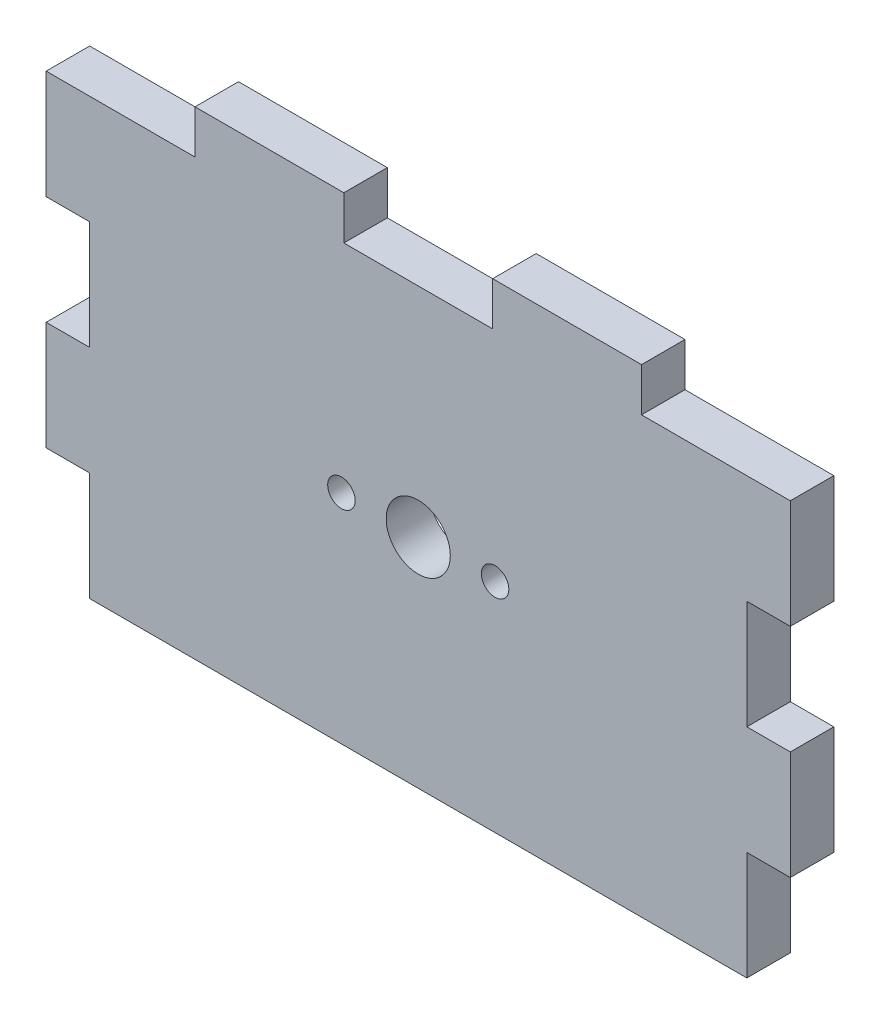
ISO-10303-21;
HEADER;
FILE_DESCRIPTION(('STEP AP214'),'2;1');
FILE_NAME('part.step','',(''),(''),'','','');
FILE_SCHEMA(('AUTOMOTIVE_DESIGN { 1 0 10303 214 1 1 1 1 }'));
ENDSEC;
DATA;
#1=APPLICATION_CONTEXT('core data for automotive mechanical design processes');
#2=APPLICATION_PROTOCOL_DEFINITION('international standard','automotive_design',2000,#1);
#3=PRODUCT_CONTEXT('',#1,'mechanical');
#4=PRODUCT('Part','Part','',(#3));
#5=PRODUCT_RELATED_PRODUCT_CATEGORY('part','',(#4));
#6=PRODUCT_DEFINITION_FORMATION('','',#4);
#7=PRODUCT_DEFINITION_CONTEXT('part definition',#1,'design');
#8=PRODUCT_DEFINITION('design','',#6,#7);
#9=PRODUCT_DEFINITION_SHAPE('','',#8);
#10=(LENGTH_UNIT() NAMED_UNIT(*) SI_UNIT(.MILLI.,.METRE.));
#11=(NAMED_UNIT(*) PLANE_ANGLE_UNIT() SI_UNIT($,.RADIAN.));
#12=(NAMED_UNIT(*) SI_UNIT($,.STERADIAN.) SOLID_ANGLE_UNIT());
#13=UNCERTAINTY_MEASURE_WITH_UNIT(LENGTH_MEASURE(1.E-05),#10,'distance_accuracy_value','');
#14=(GEOMETRIC_REPRESENTATION_CONTEXT(3) GLOBAL_UNCERTAINTY_ASSIGNED_CONTEXT((#13)) GLOBAL_UNIT_ASSIGNED_CONTEXT((#10,
#11,#12)) REPRESENTATION_CONTEXT('',''));
#15=CARTESIAN_POINT('',(0.,0.,0.));
#16=DIRECTION('',(0.,0.,1.));
#17=DIRECTION('',(1.,0.,0.));
#18=AXIS2_PLACEMENT_3D('',#15,#16,#17);
#19=CARTESIAN_POINT('',(-5.53524932452526,14.1108572179902,4.826));
#20=DIRECTION('',(-1.,0.,0.));
#21=DIRECTION('',(0.,0.,1.));
#22=AXIS2_PLACEMENT_3D('',#19,#20,#21);
#23=PLANE('',#22);
#24=DIRECTION('',(0.,1.,0.));
#25=VECTOR('',#24,1.);
#26=CARTESIAN_POINT('',(-5.53524932452526,14.1108572179902,4.826));
#27=LINE('',#26,#25);
#28=CARTESIAN_POINT('',(-5.53524932452527,-2.78014278200983,4.826));
#29=VERTEX_POINT('',#28);
#30=CARTESIAN_POINT('',(-5.53524932452526,9.28485721799016,4.826));
#31=VERTEX_POINT('',#30);
#32=EDGE_CURVE('E367',#29,#31,#27,.T.);
#33=ORIENTED_EDGE('',*,*,#32,.F.);
#34=DIRECTION('',(0.,0.,1.));
#35=VECTOR('',#34,1.);
#36=CARTESIAN_POINT('',(-5.53524932452527,-2.78014278200983,0.));
#37=LINE('',#36,#35);
#38=CARTESIAN_POINT('',(-5.53524932452527,-2.78014278200983,0.));
#39=VERTEX_POINT('',#38);
#40=EDGE_CURVE('E228',#39,#29,#37,.T.);
#41=ORIENTED_EDGE('',*,*,#40,.F.);
#42=DIRECTION('',(0.,1.,0.));
#43=VECTOR('',#42,1.);
#44=CARTESIAN_POINT('',(-5.53524932452526,14.1108572179902,0.));
#45=LINE('',#44,#43);
#46=CARTESIAN_POINT('',(-5.53524932452526,9.28485721799016,0.));
#47=VERTEX_POINT('',#46);
#48=EDGE_CURVE('E215',#39,#47,#45,.T.);
#49=ORIENTED_EDGE('',*,*,#48,.T.);
#50=DIRECTION('',(0.,0.,1.));
#51=VECTOR('',#50,1.);
#52=CARTESIAN_POINT('',(-5.53524932452526,9.28485721799016,0.));
#53=LINE('',#52,#51);
#54=EDGE_CURVE('E310',#47,#31,#53,.T.);
#55=ORIENTED_EDGE('',*,*,#54,.T.);
#56=EDGE_LOOP('',(#33,#41,#49,#55));
#57=FACE_BOUND('',#56,.T.);
#58=ADVANCED_FACE('F33',(#57),#23,.F.);
#59=CARTESIAN_POINT('',(-88.0852493245253,14.1108572179902,4.826));
#60=DIRECTION('',(1.,0.,0.));
#61=DIRECTION('',(0.,0.,-1.));
#62=AXIS2_PLACEMENT_3D('',#59,#60,#61);
#63=PLANE('',#62);
#64=DIRECTION('',(0.,-1.,0.));
#65=VECTOR('',#64,1.);
#66=CARTESIAN_POINT('',(-88.0852493245253,14.1108572179902,0.));
#67=LINE('',#66,#65);
#68=CARTESIAN_POINT('',(-88.0852493245253,9.28485721799016,0.));
#69=VERTEX_POINT('',#68);
#70=CARTESIAN_POINT('',(-88.0852493245253,-2.78014278200984,0.));
#71=VERTEX_POINT('',#70);
#72=EDGE_CURVE('E371',#69,#71,#67,.T.);
#73=ORIENTED_EDGE('',*,*,#72,.T.);
#74=DIRECTION('',(0.,0.,1.));
#75=VECTOR('',#74,1.);
#76=CARTESIAN_POINT('',(-88.0852493245253,-2.78014278200984,0.));
#77=LINE('',#76,#75);
#78=CARTESIAN_POINT('',(-88.0852493245253,-2.78014278200984,4.826));
#79=VERTEX_POINT('',#78);
#80=EDGE_CURVE('E268',#71,#79,#77,.T.);
#81=ORIENTED_EDGE('',*,*,#80,.T.);
#82=DIRECTION('',(0.,-1.,0.));
#83=VECTOR('',#82,1.);
#84=CARTESIAN_POINT('',(-88.0852493245253,14.1108572179902,4.826));
#85=LINE('',#84,#83);
#86=CARTESIAN_POINT('',(-88.0852493245253,9.28485721799016,4.826));
#87=VERTEX_POINT('',#86);
#88=EDGE_CURVE('E360',#87,#79,#85,.T.);
#89=ORIENTED_EDGE('',*,*,#88,.F.);
#90=DIRECTION('',(0.,0.,1.));
#91=VECTOR('',#90,1.);
#92=CARTESIAN_POINT('',(-88.0852493245253,9.28485721799016,0.));
#93=LINE('',#92,#91);
#94=EDGE_CURVE('E348',#69,#87,#93,.T.);
#95=ORIENTED_EDGE('',*,*,#94,.F.);
#96=EDGE_LOOP('',(#73,#81,#89,#95));
#97=FACE_BOUND('',#96,.T.);
#98=ADVANCED_FACE('F427',(#97),#63,.F.);
#99=CARTESIAN_POINT('',(-88.0852493245253,14.1108572179902,4.826));
#100=DIRECTION('',(0.,-1.,0.));
#101=DIRECTION('',(0.,0.,-1.));
#102=AXIS2_PLACEMENT_3D('',#99,#100,#101);
#103=PLANE('',#102);
#104=DIRECTION('',(-1.,0.,0.));
#105=VECTOR('',#104,1.);
#106=CARTESIAN_POINT('',(-88.0852493245253,14.1108572179902,4.826));
#107=LINE('',#106,#105);
#108=CARTESIAN_POINT('',(-55.0652493245253,14.1108572179902,4.826));
#109=VERTEX_POINT('',#108);
#110=CARTESIAN_POINT('',(-71.5752493245253,14.1108572179902,4.826));
#111=VERTEX_POINT('',#110);
#112=EDGE_CURVE('E42',#109,#111,#107,.T.);
#113=ORIENTED_EDGE('',*,*,#112,.F.);
#114=DIRECTION('',(0.,0.,1.));
#115=VECTOR('',#114,1.);
#116=CARTESIAN_POINT('',(-55.0652493245253,14.1108572179902,0.));
#117=LINE('',#116,#115);
#118=CARTESIAN_POINT('',(-55.0652493245253,14.1108572179902,0.));
#119=VERTEX_POINT('',#118);
#120=EDGE_CURVE('E332',#119,#109,#117,.T.);
#121=ORIENTED_EDGE('',*,*,#120,.F.);
#122=DIRECTION('',(-1.,0.,0.));
#123=VECTOR('',#122,1.);
#124=CARTESIAN_POINT('',(-88.0852493245253,14.1108572179902,0.));
#125=LINE('',#124,#123);
#126=CARTESIAN_POINT('',(-71.5752493245253,14.1108572179902,0.));
#127=VERTEX_POINT('',#126);
#128=EDGE_CURVE('E378',#119,#127,#125,.T.);
#129=ORIENTED_EDGE('',*,*,#128,.T.);
#130=DIRECTION('',(0.,0.,1.));
#131=VECTOR('',#130,1.);
#132=CARTESIAN_POINT('',(-71.5752493245253,14.1108572179902,0.));
#133=LINE('',#132,#131);
#134=EDGE_CURVE('E353',#127,#111,#133,.T.);
#135=ORIENTED_EDGE('',*,*,#134,.T.);
#136=EDGE_LOOP('',(#113,#121,#129,#135));
#137=FACE_BOUND('',#136,.T.);
#138=ADVANCED_FACE('F414',(#137),#103,.F.);
#139=CARTESIAN_POINT('',(-88.0852493245253,-14.8451427820098,4.826));
#140=VERTEX_POINT('',#139);
#141=CARTESIAN_POINT('',(-88.0852493245253,-26.9101427820098,4.826));
#142=VERTEX_POINT('',#141);
#143=EDGE_CURVE('E364',#140,#142,#85,.T.);
#144=ORIENTED_EDGE('',*,*,#143,.F.);
#145=DIRECTION('',(0.,0.,1.));
#146=VECTOR('',#145,1.);
#147=CARTESIAN_POINT('',(-88.0852493245253,-14.8451427820098,0.));
#148=LINE('',#147,#146);
#149=CARTESIAN_POINT('',(-88.0852493245253,-14.8451427820098,0.));
#150=VERTEX_POINT('',#149);
#151=EDGE_CURVE('E261',#150,#140,#148,.T.);
#152=ORIENTED_EDGE('',*,*,#151,.F.);
#153=CARTESIAN_POINT('',(-88.0852493245253,-26.9101427820098,0.));
#154=VERTEX_POINT('',#153);
#155=EDGE_CURVE('E356',#150,#154,#67,.T.);
#156=ORIENTED_EDGE('',*,*,#155,.T.);
#157=DIRECTION('',(0.,0.,1.));
#158=VECTOR('',#157,1.);
#159=CARTESIAN_POINT('',(-88.0852493245253,-26.9101427820098,0.));
#160=LINE('',#159,#158);
#161=EDGE_CURVE('E289',#154,#142,#160,.T.);
#162=ORIENTED_EDGE('',*,*,#161,.T.);
#163=EDGE_LOOP('',(#144,#152,#156,#162));
#164=FACE_BOUND('',#163,.T.);
#165=ADVANCED_FACE('F35',(#164),#63,.F.);
#166=CARTESIAN_POINT('',(-88.0852493245253,-38.9751427820098,4.826));
#167=DIRECTION('',(0.,1.,0.));
#168=DIRECTION('',(0.,0.,1.));
#169=AXIS2_PLACEMENT_3D('',#166,#167,#168);
#170=PLANE('',#169);
#171=DIRECTION('',(1.,0.,0.));
#172=VECTOR('',#171,1.);
#173=CARTESIAN_POINT('',(-88.0852493245253,-38.9751427820098,0.));
#174=LINE('',#173,#172);
#175=CARTESIAN_POINT('',(-83.2592493245252,-38.9751427820098,0.));
#176=VERTEX_POINT('',#175);
#177=CARTESIAN_POINT('',(-10.3612493245253,-38.9751427820098,0.));
#178=VERTEX_POINT('',#177);
#179=EDGE_CURVE('E374',#176,#178,#174,.T.);
#180=ORIENTED_EDGE('',*,*,#179,.T.);
#181=DIRECTION('',(0.,0.,1.));
#182=VECTOR('',#181,1.);
#183=CARTESIAN_POINT('',(-10.3612493245253,-38.9751427820098,0.));
#184=LINE('',#183,#182);
#185=CARTESIAN_POINT('',(-10.3612493245253,-38.9751427820098,4.826));
#186=VERTEX_POINT('',#185);
#187=EDGE_CURVE('E244',#178,#186,#184,.T.);
#188=ORIENTED_EDGE('',*,*,#187,.T.);
#189=DIRECTION('',(1.,0.,0.));
#190=VECTOR('',#189,1.);
#191=CARTESIAN_POINT('',(-88.0852493245253,-38.9751427820098,4.826));
#192=LINE('',#191,#190);
#193=CARTESIAN_POINT('',(-83.2592493245252,-38.9751427820098,4.826));
#194=VERTEX_POINT('',#193);
#195=EDGE_CURVE('E363',#194,#186,#192,.T.);
#196=ORIENTED_EDGE('',*,*,#195,.F.);
#197=DIRECTION('',(0.,0.,1.));
#198=VECTOR('',#197,1.);
#199=CARTESIAN_POINT('',(-83.2592493245252,-38.9751427820098,0.));
#200=LINE('',#199,#198);
#201=EDGE_CURVE('E284',#176,#194,#200,.T.);
#202=ORIENTED_EDGE('',*,*,#201,.F.);
#203=EDGE_LOOP('',(#180,#188,#196,#202));
#204=FACE_BOUND('',#203,.T.);
#205=ADVANCED_FACE('F455',(#204),#170,.F.);
#206=CARTESIAN_POINT('',(-5.53524932452526,-26.9101427820098,0.));
#207=VERTEX_POINT('',#206);
#208=CARTESIAN_POINT('',(-5.53524932452527,-14.8451427820098,0.));
#209=VERTEX_POINT('',#208);
#210=EDGE_CURVE('E376',#207,#209,#45,.T.);
#211=ORIENTED_EDGE('',*,*,#210,.T.);
#212=DIRECTION('',(0.,0.,1.));
#213=VECTOR('',#212,1.);
#214=CARTESIAN_POINT('',(-5.53524932452527,-14.8451427820098,0.));
#215=LINE('',#214,#213);
#216=CARTESIAN_POINT('',(-5.53524932452527,-14.8451427820098,4.826));
#217=VERTEX_POINT('',#216);
#218=EDGE_CURVE('E231',#209,#217,#215,.T.);
#219=ORIENTED_EDGE('',*,*,#218,.T.);
#220=CARTESIAN_POINT('',(-5.53524932452526,-26.9101427820098,4.826));
#221=VERTEX_POINT('',#220);
#222=EDGE_CURVE('E368',#221,#217,#27,.T.);
#223=ORIENTED_EDGE('',*,*,#222,.F.);
#224=DIRECTION('',(0.,0.,1.));
#225=VECTOR('',#224,1.);
#226=CARTESIAN_POINT('',(-5.53524932452526,-26.9101427820098,0.));
#227=LINE('',#226,#225);
#228=EDGE_CURVE('E240',#207,#221,#227,.T.);
#229=ORIENTED_EDGE('',*,*,#228,.F.);
#230=EDGE_LOOP('',(#211,#219,#223,#229));
#231=FACE_BOUND('',#230,.T.);
#232=ADVANCED_FACE('F462',(#231),#23,.F.);
#233=CARTESIAN_POINT('',(-22.0452493245253,14.1108572179902,4.826));
#234=VERTEX_POINT('',#233);
#235=CARTESIAN_POINT('',(-38.5552493245253,14.1108572179902,4.826));
#236=VERTEX_POINT('',#235);
#237=EDGE_CURVE('E11',#234,#236,#107,.T.);
#238=ORIENTED_EDGE('',*,*,#237,.F.);
#239=DIRECTION('',(0.,0.,1.));
#240=VECTOR('',#239,1.);
#241=CARTESIAN_POINT('',(-22.0452493245253,14.1108572179902,0.));
#242=LINE('',#241,#240);
#243=CARTESIAN_POINT('',(-22.0452493245253,14.1108572179902,0.));
#244=VERTEX_POINT('',#243);
#245=EDGE_CURVE('E307',#244,#234,#242,.T.);
#246=ORIENTED_EDGE('',*,*,#245,.F.);
#247=CARTESIAN_POINT('',(-38.5552493245253,14.1108572179902,0.));
#248=VERTEX_POINT('',#247);
#249=EDGE_CURVE('E37',#244,#248,#125,.T.);
#250=ORIENTED_EDGE('',*,*,#249,.T.);
#251=DIRECTION('',(0.,0.,1.));
#252=VECTOR('',#251,1.);
#253=CARTESIAN_POINT('',(-38.5552493245253,14.1108572179902,0.));
#254=LINE('',#253,#252);
#255=EDGE_CURVE('E335',#248,#236,#254,.T.);
#256=ORIENTED_EDGE('',*,*,#255,.T.);
#257=EDGE_LOOP('',(#238,#246,#250,#256));
#258=FACE_BOUND('',#257,.T.);
#259=ADVANCED_FACE('F396',(#258),#103,.F.);
#260=CARTESIAN_POINT('',(0.,0.,4.826));
#261=DIRECTION('',(0.,0.,1.));
#262=DIRECTION('',(1.,0.,0.));
#263=AXIS2_PLACEMENT_3D('',#260,#261,#262);
#264=PLANE('',#263);
#265=CARTESIAN_POINT('',(-38.2885493245253,-14.8451427820098,4.826));
#266=DIRECTION('',(0.,0.,1.));
#267=DIRECTION('',(-1.,0.,0.));
#268=AXIS2_PLACEMENT_3D('',#265,#266,#267);
#269=CIRCLE('',#268,1.524);
#270=CARTESIAN_POINT('',(-39.8125493245253,-14.8451427820098,4.826));
#271=VERTEX_POINT('',#270);
#272=EDGE_CURVE('E603',#271,#271,#269,.T.);
#273=ORIENTED_EDGE('',*,*,#272,.F.);
#274=EDGE_LOOP('',(#273));
#275=FACE_BOUND('',#274,.T.);
#276=CARTESIAN_POINT('',(-55.3319493245253,-14.8451427820098,4.826));
#277=DIRECTION('',(0.,0.,1.));
#278=DIRECTION('',(1.,0.,0.));
#279=AXIS2_PLACEMENT_3D('',#276,#277,#278);
#280=CIRCLE('',#279,1.524);
#281=CARTESIAN_POINT('',(-53.8079493245253,-14.8451427820098,4.826));
#282=VERTEX_POINT('',#281);
#283=EDGE_CURVE('E605',#282,#282,#280,.T.);
#284=ORIENTED_EDGE('',*,*,#283,.F.);
#285=EDGE_LOOP('',(#284));
#286=FACE_BOUND('',#285,.T.);
#287=CARTESIAN_POINT('',(-46.8102493245253,-14.8451427820098,4.826));
#288=DIRECTION('',(0.,0.,1.));
#289=DIRECTION('',(1.,0.,0.));
#290=AXIS2_PLACEMENT_3D('',#287,#288,#289);
#291=CIRCLE('',#290,3.55600000000001);
#292=CARTESIAN_POINT('',(-43.2542493245253,-14.8451427820098,4.826));
#293=VERTEX_POINT('',#292);
#294=EDGE_CURVE('E221',#293,#293,#291,.T.);
#295=ORIENTED_EDGE('',*,*,#294,.F.);
#296=EDGE_LOOP('',(#295));
#297=FACE_BOUND('',#296,.T.);
#298=DIRECTION('',(-1.,0.,0.));
#299=VECTOR('',#298,1.);
#300=CARTESIAN_POINT('',(-5.53524932452527,-2.78014278200983,4.826));
#301=LINE('',#300,#299);
#302=CARTESIAN_POINT('',(-10.3612493245253,-2.78014278200983,4.826));
#303=VERTEX_POINT('',#302);
#304=EDGE_CURVE('E201',#29,#303,#301,.T.);
#305=ORIENTED_EDGE('',*,*,#304,.F.);
#306=ORIENTED_EDGE('',*,*,#32,.T.);
#307=DIRECTION('',(1.,0.,0.));
#308=VECTOR('',#307,1.);
#309=CARTESIAN_POINT('',(-22.0452493245253,9.28485721799016,4.826));
#310=LINE('',#309,#308);
#311=CARTESIAN_POINT('',(-22.0452493245253,9.28485721799016,4.826));
#312=VERTEX_POINT('',#311);
#313=EDGE_CURVE('E300',#312,#31,#310,.T.);
#314=ORIENTED_EDGE('',*,*,#313,.F.);
#315=DIRECTION('',(0.,-1.,0.));
#316=VECTOR('',#315,1.);
#317=CARTESIAN_POINT('',(-22.0452493245253,14.1108572179902,4.826));
#318=LINE('',#317,#316);
#319=EDGE_CURVE('E292',#234,#312,#318,.T.);
#320=ORIENTED_EDGE('',*,*,#319,.F.);
#321=ORIENTED_EDGE('',*,*,#237,.T.);
#322=DIRECTION('',(0.,1.,0.));
#323=VECTOR('',#322,1.);
#324=CARTESIAN_POINT('',(-38.5552493245253,14.1108572179902,4.826));
#325=LINE('',#324,#323);
#326=CARTESIAN_POINT('',(-38.5552493245253,9.28485721799016,4.826));
#327=VERTEX_POINT('',#326);
#328=EDGE_CURVE('E318',#327,#236,#325,.T.);
#329=ORIENTED_EDGE('',*,*,#328,.F.);
#330=DIRECTION('',(1.,0.,0.));
#331=VECTOR('',#330,1.);
#332=CARTESIAN_POINT('',(-55.0652493245253,9.28485721799016,4.826));
#333=LINE('',#332,#331);
#334=CARTESIAN_POINT('',(-55.0652493245253,9.28485721799016,4.826));
#335=VERTEX_POINT('',#334);
#336=EDGE_CURVE('E327',#335,#327,#333,.T.);
#337=ORIENTED_EDGE('',*,*,#336,.F.);
#338=DIRECTION('',(0.,-1.,0.));
#339=VECTOR('',#338,1.);
#340=CARTESIAN_POINT('',(-55.0652493245253,14.1108572179902,4.826));
#341=LINE('',#340,#339);
#342=EDGE_CURVE('E309',#109,#335,#341,.T.);
#343=ORIENTED_EDGE('',*,*,#342,.F.);
#344=ORIENTED_EDGE('',*,*,#112,.T.);
#345=DIRECTION('',(0.,1.,0.));
#346=VECTOR('',#345,1.);
#347=CARTESIAN_POINT('',(-71.5752493245253,14.1108572179902,4.826));
#348=LINE('',#347,#346);
#349=CARTESIAN_POINT('',(-71.5752493245253,9.28485721799016,4.826));
#350=VERTEX_POINT('',#349);
#351=EDGE_CURVE('E345',#350,#111,#348,.T.);
#352=ORIENTED_EDGE('',*,*,#351,.F.);
#353=DIRECTION('',(1.,0.,0.));
#354=VECTOR('',#353,1.);
#355=CARTESIAN_POINT('',(-88.0852493245253,9.28485721799016,4.826));
#356=LINE('',#355,#354);
#357=EDGE_CURVE('E334',#87,#350,#356,.T.);
#358=ORIENTED_EDGE('',*,*,#357,.F.);
#359=ORIENTED_EDGE('',*,*,#88,.T.);
#360=DIRECTION('',(-1.,0.,0.));
#361=VECTOR('',#360,1.);
#362=CARTESIAN_POINT('',(-88.0852493245253,-2.78014278200984,4.826));
#363=LINE('',#362,#361);
#364=CARTESIAN_POINT('',(-83.2592493245253,-2.78014278200984,4.826));
#365=VERTEX_POINT('',#364);
#366=EDGE_CURVE('E255',#365,#79,#363,.T.);
#367=ORIENTED_EDGE('',*,*,#366,.F.);
#368=DIRECTION('',(0.,1.,0.));
#369=VECTOR('',#368,1.);
#370=CARTESIAN_POINT('',(-83.2592493245253,-2.78014278200984,4.826));
#371=LINE('',#370,#369);
#372=CARTESIAN_POINT('',(-83.2592493245253,-14.8451427820098,4.826));
#373=VERTEX_POINT('',#372);
#374=EDGE_CURVE('E264',#373,#365,#371,.T.);
#375=ORIENTED_EDGE('',*,*,#374,.F.);
#376=DIRECTION('',(1.,0.,0.));
#377=VECTOR('',#376,1.);
#378=CARTESIAN_POINT('',(-88.0852493245253,-14.8451427820098,4.826));
#379=LINE('',#378,#377);
#380=EDGE_CURVE('E247',#140,#373,#379,.T.);
#381=ORIENTED_EDGE('',*,*,#380,.F.);
#382=ORIENTED_EDGE('',*,*,#143,.T.);
#383=DIRECTION('',(-1.,0.,0.));
#384=VECTOR('',#383,1.);
#385=CARTESIAN_POINT('',(-88.0852493245253,-26.9101427820098,4.826));
#386=LINE('',#385,#384);
#387=CARTESIAN_POINT('',(-83.2592493245253,-26.9101427820098,4.826));
#388=VERTEX_POINT('',#387);
#389=EDGE_CURVE('E281',#388,#142,#386,.T.);
#390=ORIENTED_EDGE('',*,*,#389,.F.);
#391=DIRECTION('',(0.,1.,0.));
#392=VECTOR('',#391,1.);
#393=CARTESIAN_POINT('',(-83.2592493245252,-38.9751427820098,4.826));
#394=LINE('',#393,#392);
#395=EDGE_CURVE('E271',#194,#388,#394,.T.);
#396=ORIENTED_EDGE('',*,*,#395,.F.);
#397=ORIENTED_EDGE('',*,*,#195,.T.);
#398=DIRECTION('',(0.,-1.,0.));
#399=VECTOR('',#398,1.);
#400=CARTESIAN_POINT('',(-10.3612493245253,-38.9751427820098,4.826));
#401=LINE('',#400,#399);
#402=CARTESIAN_POINT('',(-10.3612493245253,-26.9101427820098,4.826));
#403=VERTEX_POINT('',#402);
#404=EDGE_CURVE('E238',#403,#186,#401,.T.);
#405=ORIENTED_EDGE('',*,*,#404,.F.);
#406=DIRECTION('',(-1.,0.,0.));
#407=VECTOR('',#406,1.);
#408=CARTESIAN_POINT('',(-5.53524932452526,-26.9101427820098,4.826));
#409=LINE('',#408,#407);
#410=EDGE_CURVE('E230',#221,#403,#409,.T.);
#411=ORIENTED_EDGE('',*,*,#410,.F.);
#412=ORIENTED_EDGE('',*,*,#222,.T.);
#413=DIRECTION('',(1.,0.,0.));
#414=VECTOR('',#413,1.);
#415=CARTESIAN_POINT('',(-5.53524932452527,-14.8451427820098,4.826));
#416=LINE('',#415,#414);
#417=CARTESIAN_POINT('',(-10.3612493245253,-14.8451427820098,4.826));
#418=VERTEX_POINT('',#417);
#419=EDGE_CURVE('E216',#418,#217,#416,.T.);
#420=ORIENTED_EDGE('',*,*,#419,.F.);
#421=DIRECTION('',(0.,-1.,0.));
#422=VECTOR('',#421,1.);
#423=CARTESIAN_POINT('',(-10.3612493245253,-2.78014278200983,4.826));
#424=LINE('',#423,#422);
#425=EDGE_CURVE('E218',#303,#418,#424,.T.);
#426=ORIENTED_EDGE('',*,*,#425,.F.);
#427=EDGE_LOOP('',(#305,#306,#314,#320,#321,#329,#337,#343,#344,#352,#358,#359,#367,#375,#381,
#382,#390,#396,#397,#405,#411,#412,#420,#426));
#428=FACE_BOUND('',#427,.T.);
#429=ADVANCED_FACE('F400',(#275,#286,#297,#428),#264,.T.);
#430=CARTESIAN_POINT('',(0.,0.,0.));
#431=DIRECTION('',(0.,0.,1.));
#432=DIRECTION('',(1.,0.,0.));
#433=AXIS2_PLACEMENT_3D('',#430,#431,#432);
#434=PLANE('',#433);
#435=CARTESIAN_POINT('',(-38.2885493245253,-14.8451427820098,0.));
#436=DIRECTION('',(0.,0.,1.));
#437=DIRECTION('',(-1.,0.,0.));
#438=AXIS2_PLACEMENT_3D('',#435,#436,#437);
#439=CIRCLE('',#438,1.524);
#440=CARTESIAN_POINT('',(-39.8125493245253,-14.8451427820098,0.));
#441=VERTEX_POINT('',#440);
#442=EDGE_CURVE('E600',#441,#441,#439,.T.);
#443=ORIENTED_EDGE('',*,*,#442,.T.);
#444=EDGE_LOOP('',(#443));
#445=FACE_BOUND('',#444,.T.);
#446=CARTESIAN_POINT('',(-55.3319493245253,-14.8451427820098,0.));
#447=DIRECTION('',(0.,0.,1.));
#448=DIRECTION('',(1.,0.,0.));
#449=AXIS2_PLACEMENT_3D('',#446,#447,#448);
#450=CIRCLE('',#449,1.524);
#451=CARTESIAN_POINT('',(-53.8079493245253,-14.8451427820098,0.));
#452=VERTEX_POINT('',#451);
#453=EDGE_CURVE('E608',#452,#452,#450,.T.);
#454=ORIENTED_EDGE('',*,*,#453,.T.);
#455=EDGE_LOOP('',(#454));
#456=FACE_BOUND('',#455,.T.);
#457=CARTESIAN_POINT('',(-46.8102493245253,-14.8451427820098,0.));
#458=DIRECTION('',(0.,0.,1.));
#459=DIRECTION('',(1.,0.,0.));
#460=AXIS2_PLACEMENT_3D('',#457,#458,#459);
#461=CIRCLE('',#460,3.55600000000001);
#462=CARTESIAN_POINT('',(-43.2542493245253,-14.8451427820098,0.));
#463=VERTEX_POINT('',#462);
#464=EDGE_CURVE('E226',#463,#463,#461,.T.);
#465=ORIENTED_EDGE('',*,*,#464,.T.);
#466=EDGE_LOOP('',(#465));
#467=FACE_BOUND('',#466,.T.);
#468=ORIENTED_EDGE('',*,*,#48,.F.);
#469=DIRECTION('',(-1.,0.,0.));
#470=VECTOR('',#469,1.);
#471=CARTESIAN_POINT('',(-5.53524932452527,-2.78014278200983,0.));
#472=LINE('',#471,#470);
#473=CARTESIAN_POINT('',(-10.3612493245253,-2.78014278200983,0.));
#474=VERTEX_POINT('',#473);
#475=EDGE_CURVE('E198',#39,#474,#472,.T.);
#476=ORIENTED_EDGE('',*,*,#475,.T.);
#477=DIRECTION('',(0.,-1.,0.));
#478=VECTOR('',#477,1.);
#479=CARTESIAN_POINT('',(-10.3612493245253,-2.78014278200983,0.));
#480=LINE('',#479,#478);
#481=CARTESIAN_POINT('',(-10.3612493245253,-14.8451427820098,0.));
#482=VERTEX_POINT('',#481);
#483=EDGE_CURVE('E208',#474,#482,#480,.T.);
#484=ORIENTED_EDGE('',*,*,#483,.T.);
#485=DIRECTION('',(1.,0.,0.));
#486=VECTOR('',#485,1.);
#487=CARTESIAN_POINT('',(-5.53524932452527,-14.8451427820098,0.));
#488=LINE('',#487,#486);
#489=EDGE_CURVE('E50',#482,#209,#488,.T.);
#490=ORIENTED_EDGE('',*,*,#489,.T.);
#491=ORIENTED_EDGE('',*,*,#210,.F.);
#492=DIRECTION('',(-1.,0.,0.));
#493=VECTOR('',#492,1.);
#494=CARTESIAN_POINT('',(-5.53524932452526,-26.9101427820098,0.));
#495=LINE('',#494,#493);
#496=CARTESIAN_POINT('',(-10.3612493245253,-26.9101427820098,0.));
#497=VERTEX_POINT('',#496);
#498=EDGE_CURVE('E235',#207,#497,#495,.T.);
#499=ORIENTED_EDGE('',*,*,#498,.T.);
#500=DIRECTION('',(0.,-1.,0.));
#501=VECTOR('',#500,1.);
#502=CARTESIAN_POINT('',(-10.3612493245253,-38.9751427820098,0.));
#503=LINE('',#502,#501);
#504=EDGE_CURVE('E58',#497,#178,#503,.T.);
#505=ORIENTED_EDGE('',*,*,#504,.T.);
#506=ORIENTED_EDGE('',*,*,#179,.F.);
#507=DIRECTION('',(0.,1.,0.));
#508=VECTOR('',#507,1.);
#509=CARTESIAN_POINT('',(-83.2592493245252,-38.9751427820098,0.));
#510=LINE('',#509,#508);
#511=CARTESIAN_POINT('',(-83.2592493245253,-26.9101427820098,0.));
#512=VERTEX_POINT('',#511);
#513=EDGE_CURVE('E277',#176,#512,#510,.T.);
#514=ORIENTED_EDGE('',*,*,#513,.T.);
#515=DIRECTION('',(-1.,0.,0.));
#516=VECTOR('',#515,1.);
#517=CARTESIAN_POINT('',(-88.0852493245253,-26.9101427820098,0.));
#518=LINE('',#517,#516);
#519=EDGE_CURVE('E280',#512,#154,#518,.T.);
#520=ORIENTED_EDGE('',*,*,#519,.T.);
#521=ORIENTED_EDGE('',*,*,#155,.F.);
#522=DIRECTION('',(1.,0.,0.));
#523=VECTOR('',#522,1.);
#524=CARTESIAN_POINT('',(-88.0852493245253,-14.8451427820098,0.));
#525=LINE('',#524,#523);
#526=CARTESIAN_POINT('',(-83.2592493245253,-14.8451427820098,0.));
#527=VERTEX_POINT('',#526);
#528=EDGE_CURVE('E251',#150,#527,#525,.T.);
#529=ORIENTED_EDGE('',*,*,#528,.T.);
#530=DIRECTION('',(0.,1.,0.));
#531=VECTOR('',#530,1.);
#532=CARTESIAN_POINT('',(-83.2592493245253,-2.78014278200984,0.));
#533=LINE('',#532,#531);
#534=CARTESIAN_POINT('',(-83.2592493245253,-2.78014278200984,0.));
#535=VERTEX_POINT('',#534);
#536=EDGE_CURVE('E254',#527,#535,#533,.T.);
#537=ORIENTED_EDGE('',*,*,#536,.T.);
#538=DIRECTION('',(-1.,0.,0.));
#539=VECTOR('',#538,1.);
#540=CARTESIAN_POINT('',(-88.0852493245253,-2.78014278200984,0.));
#541=LINE('',#540,#539);
#542=EDGE_CURVE('E258',#535,#71,#541,.T.);
#543=ORIENTED_EDGE('',*,*,#542,.T.);
#544=ORIENTED_EDGE('',*,*,#72,.F.);
#545=DIRECTION('',(1.,0.,0.));
#546=VECTOR('',#545,1.);
#547=CARTESIAN_POINT('',(-88.0852493245253,9.28485721799016,0.));
#548=LINE('',#547,#546);
#549=CARTESIAN_POINT('',(-71.5752493245253,9.28485721799016,0.));
#550=VERTEX_POINT('',#549);
#551=EDGE_CURVE('E341',#69,#550,#548,.T.);
#552=ORIENTED_EDGE('',*,*,#551,.T.);
#553=DIRECTION('',(0.,1.,0.));
#554=VECTOR('',#553,1.);
#555=CARTESIAN_POINT('',(-71.5752493245253,14.1108572179902,0.));
#556=LINE('',#555,#554);
#557=EDGE_CURVE('E344',#550,#127,#556,.T.);
#558=ORIENTED_EDGE('',*,*,#557,.T.);
#559=ORIENTED_EDGE('',*,*,#128,.F.);
#560=DIRECTION('',(0.,-1.,0.));
#561=VECTOR('',#560,1.);
#562=CARTESIAN_POINT('',(-55.0652493245253,14.1108572179902,0.));
#563=LINE('',#562,#561);
#564=CARTESIAN_POINT('',(-55.0652493245253,9.28485721799016,0.));
#565=VERTEX_POINT('',#564);
#566=EDGE_CURVE('E314',#119,#565,#563,.T.);
#567=ORIENTED_EDGE('',*,*,#566,.T.);
#568=DIRECTION('',(1.,0.,0.));
#569=VECTOR('',#568,1.);
#570=CARTESIAN_POINT('',(-55.0652493245253,9.28485721799016,0.));
#571=LINE('',#570,#569);
#572=CARTESIAN_POINT('',(-38.5552493245253,9.28485721799016,0.));
#573=VERTEX_POINT('',#572);
#574=EDGE_CURVE('E317',#565,#573,#571,.T.);
#575=ORIENTED_EDGE('',*,*,#574,.T.);
#576=DIRECTION('',(0.,1.,0.));
#577=VECTOR('',#576,1.);
#578=CARTESIAN_POINT('',(-38.5552493245253,14.1108572179902,0.));
#579=LINE('',#578,#577);
#580=EDGE_CURVE('E321',#573,#248,#579,.T.);
#581=ORIENTED_EDGE('',*,*,#580,.T.);
#582=ORIENTED_EDGE('',*,*,#249,.F.);
#583=DIRECTION('',(0.,-1.,0.));
#584=VECTOR('',#583,1.);
#585=CARTESIAN_POINT('',(-22.0452493245253,14.1108572179902,0.));
#586=LINE('',#585,#584);
#587=CARTESIAN_POINT('',(-22.0452493245253,9.28485721799016,0.));
#588=VERTEX_POINT('',#587);
#589=EDGE_CURVE('E296',#244,#588,#586,.T.);
#590=ORIENTED_EDGE('',*,*,#589,.T.);
#591=DIRECTION('',(1.,0.,0.));
#592=VECTOR('',#591,1.);
#593=CARTESIAN_POINT('',(-22.0452493245253,9.28485721799016,0.));
#594=LINE('',#593,#592);
#595=EDGE_CURVE('E299',#588,#47,#594,.T.);
#596=ORIENTED_EDGE('',*,*,#595,.T.);
#597=EDGE_LOOP('',(#468,#476,#484,#490,#491,#499,#505,#506,#514,#520,#521,#529,#537,#543,#544,
#552,#558,#559,#567,#575,#581,#582,#590,#596));
#598=FACE_BOUND('',#597,.T.);
#599=ADVANCED_FACE('F213',(#445,#456,#467,#598),#434,.F.);
#600=CARTESIAN_POINT('',(-71.5752493245253,14.1108572179902,0.));
#601=DIRECTION('',(1.,0.,0.));
#602=DIRECTION('',(0.,0.,-1.));
#603=AXIS2_PLACEMENT_3D('',#600,#601,#602);
#604=PLANE('',#603);
#605=ORIENTED_EDGE('',*,*,#351,.T.);
#606=ORIENTED_EDGE('',*,*,#134,.F.);
#607=ORIENTED_EDGE('',*,*,#557,.F.);
#608=DIRECTION('',(0.,0.,1.));
#609=VECTOR('',#608,1.);
#610=CARTESIAN_POINT('',(-71.5752493245253,9.28485721799016,0.));
#611=LINE('',#610,#609);
#612=EDGE_CURVE('E357',#550,#350,#611,.T.);
#613=ORIENTED_EDGE('',*,*,#612,.T.);
#614=EDGE_LOOP('',(#605,#606,#607,#613));
#615=FACE_BOUND('',#614,.T.);
#616=ADVANCED_FACE('F418',(#615),#604,.F.);
#617=CARTESIAN_POINT('',(-88.0852493245253,9.28485721799016,0.));
#618=DIRECTION('',(0.,-1.,0.));
#619=DIRECTION('',(0.,0.,-1.));
#620=AXIS2_PLACEMENT_3D('',#617,#618,#619);
#621=PLANE('',#620);
#622=ORIENTED_EDGE('',*,*,#357,.T.);
#623=ORIENTED_EDGE('',*,*,#612,.F.);
#624=ORIENTED_EDGE('',*,*,#551,.F.);
#625=ORIENTED_EDGE('',*,*,#94,.T.);
#626=EDGE_LOOP('',(#622,#623,#624,#625));
#627=FACE_BOUND('',#626,.T.);
#628=ADVANCED_FACE('F423',(#627),#621,.F.);
#629=CARTESIAN_POINT('',(-55.0652493245253,14.1108572179902,0.));
#630=DIRECTION('',(-1.,0.,0.));
#631=DIRECTION('',(0.,0.,1.));
#632=AXIS2_PLACEMENT_3D('',#629,#630,#631);
#633=PLANE('',#632);
#634=ORIENTED_EDGE('',*,*,#342,.T.);
#635=DIRECTION('',(0.,0.,1.));
#636=VECTOR('',#635,1.);
#637=CARTESIAN_POINT('',(-55.0652493245253,9.28485721799016,0.));
#638=LINE('',#637,#636);
#639=EDGE_CURVE('E324',#565,#335,#638,.T.);
#640=ORIENTED_EDGE('',*,*,#639,.F.);
#641=ORIENTED_EDGE('',*,*,#566,.F.);
#642=ORIENTED_EDGE('',*,*,#120,.T.);
#643=EDGE_LOOP('',(#634,#640,#641,#642));
#644=FACE_BOUND('',#643,.T.);
#645=ADVANCED_FACE('F503',(#644),#633,.F.);
#646=CARTESIAN_POINT('',(-38.5552493245253,14.1108572179902,0.));
#647=DIRECTION('',(1.,0.,0.));
#648=DIRECTION('',(0.,0.,-1.));
#649=AXIS2_PLACEMENT_3D('',#646,#647,#648);
#650=PLANE('',#649);
#651=ORIENTED_EDGE('',*,*,#328,.T.);
#652=ORIENTED_EDGE('',*,*,#255,.F.);
#653=ORIENTED_EDGE('',*,*,#580,.F.);
#654=DIRECTION('',(0.,0.,1.));
#655=VECTOR('',#654,1.);
#656=CARTESIAN_POINT('',(-38.5552493245253,9.28485721799016,0.));
#657=LINE('',#656,#655);
#658=EDGE_CURVE('E338',#573,#327,#657,.T.);
#659=ORIENTED_EDGE('',*,*,#658,.T.);
#660=EDGE_LOOP('',(#651,#652,#653,#659));
#661=FACE_BOUND('',#660,.T.);
#662=ADVANCED_FACE('F403',(#661),#650,.F.);
#663=CARTESIAN_POINT('',(-55.0652493245253,9.28485721799016,0.));
#664=DIRECTION('',(0.,-1.,0.));
#665=DIRECTION('',(0.,0.,-1.));
#666=AXIS2_PLACEMENT_3D('',#663,#664,#665);
#667=PLANE('',#666);
#668=ORIENTED_EDGE('',*,*,#336,.T.);
#669=ORIENTED_EDGE('',*,*,#658,.F.);
#670=ORIENTED_EDGE('',*,*,#574,.F.);
#671=ORIENTED_EDGE('',*,*,#639,.T.);
#672=EDGE_LOOP('',(#668,#669,#670,#671));
#673=FACE_BOUND('',#672,.T.);
#674=ADVANCED_FACE('F407',(#673),#667,.F.);
#675=CARTESIAN_POINT('',(-22.0452493245253,14.1108572179902,0.));
#676=DIRECTION('',(-1.,0.,0.));
#677=DIRECTION('',(0.,0.,1.));
#678=AXIS2_PLACEMENT_3D('',#675,#676,#677);
#679=PLANE('',#678);
#680=ORIENTED_EDGE('',*,*,#319,.T.);
#681=DIRECTION('',(0.,0.,1.));
#682=VECTOR('',#681,1.);
#683=CARTESIAN_POINT('',(-22.0452493245253,9.28485721799016,0.));
#684=LINE('',#683,#682);
#685=EDGE_CURVE('E302',#588,#312,#684,.T.);
#686=ORIENTED_EDGE('',*,*,#685,.F.);
#687=ORIENTED_EDGE('',*,*,#589,.F.);
#688=ORIENTED_EDGE('',*,*,#245,.T.);
#689=EDGE_LOOP('',(#680,#686,#687,#688));
#690=FACE_BOUND('',#689,.T.);
#691=ADVANCED_FACE('F392',(#690),#679,.F.);
#692=CARTESIAN_POINT('',(-22.0452493245253,9.28485721799016,0.));
#693=DIRECTION('',(0.,-1.,0.));
#694=DIRECTION('',(0.,0.,-1.));
#695=AXIS2_PLACEMENT_3D('',#692,#693,#694);
#696=PLANE('',#695);
#697=ORIENTED_EDGE('',*,*,#313,.T.);
#698=ORIENTED_EDGE('',*,*,#54,.F.);
#699=ORIENTED_EDGE('',*,*,#595,.F.);
#700=ORIENTED_EDGE('',*,*,#685,.T.);
#701=EDGE_LOOP('',(#697,#698,#699,#700));
#702=FACE_BOUND('',#701,.T.);
#703=ADVANCED_FACE('F387',(#702),#696,.F.);
#704=CARTESIAN_POINT('',(-88.0852493245253,-26.9101427820098,0.));
#705=DIRECTION('',(0.,1.,0.));
#706=DIRECTION('',(0.,0.,1.));
#707=AXIS2_PLACEMENT_3D('',#704,#705,#706);
#708=PLANE('',#707);
#709=ORIENTED_EDGE('',*,*,#389,.T.);
#710=ORIENTED_EDGE('',*,*,#161,.F.);
#711=ORIENTED_EDGE('',*,*,#519,.F.);
#712=DIRECTION('',(0.,0.,1.));
#713=VECTOR('',#712,1.);
#714=CARTESIAN_POINT('',(-83.2592493245253,-26.9101427820098,0.));
#715=LINE('',#714,#713);
#716=EDGE_CURVE('E293',#512,#388,#715,.T.);
#717=ORIENTED_EDGE('',*,*,#716,.T.);
#718=EDGE_LOOP('',(#709,#710,#711,#717));
#719=FACE_BOUND('',#718,.T.);
#720=ADVANCED_FACE('F446',(#719),#708,.F.);
#721=CARTESIAN_POINT('',(-83.2592493245252,-38.9751427820098,0.));
#722=DIRECTION('',(1.,0.,0.));
#723=DIRECTION('',(0.,1.,0.));
#724=AXIS2_PLACEMENT_3D('',#721,#722,#723);
#725=PLANE('',#724);
#726=ORIENTED_EDGE('',*,*,#395,.T.);
#727=ORIENTED_EDGE('',*,*,#716,.F.);
#728=ORIENTED_EDGE('',*,*,#513,.F.);
#729=ORIENTED_EDGE('',*,*,#201,.T.);
#730=EDGE_LOOP('',(#726,#727,#728,#729));
#731=FACE_BOUND('',#730,.T.);
#732=ADVANCED_FACE('F451',(#731),#725,.F.);
#733=CARTESIAN_POINT('',(-88.0852493245253,-2.78014278200984,0.));
#734=DIRECTION('',(0.,1.,0.));
#735=DIRECTION('',(-1.,0.,0.));
#736=AXIS2_PLACEMENT_3D('',#733,#734,#735);
#737=PLANE('',#736);
#738=ORIENTED_EDGE('',*,*,#366,.T.);
#739=ORIENTED_EDGE('',*,*,#80,.F.);
#740=ORIENTED_EDGE('',*,*,#542,.F.);
#741=DIRECTION('',(0.,0.,1.));
#742=VECTOR('',#741,1.);
#743=CARTESIAN_POINT('',(-83.2592493245253,-2.78014278200984,0.));
#744=LINE('',#743,#742);
#745=EDGE_CURVE('E272',#535,#365,#744,.T.);
#746=ORIENTED_EDGE('',*,*,#745,.T.);
#747=EDGE_LOOP('',(#738,#739,#740,#746));
#748=FACE_BOUND('',#747,.T.);
#749=ADVANCED_FACE('F432',(#748),#737,.F.);
#750=CARTESIAN_POINT('',(-83.2592493245253,-2.78014278200984,0.));
#751=DIRECTION('',(1.,0.,0.));
#752=DIRECTION('',(0.,0.,-1.));
#753=AXIS2_PLACEMENT_3D('',#750,#751,#752);
#754=PLANE('',#753);
#755=ORIENTED_EDGE('',*,*,#374,.T.);
#756=ORIENTED_EDGE('',*,*,#745,.F.);
#757=ORIENTED_EDGE('',*,*,#536,.F.);
#758=DIRECTION('',(0.,0.,1.));
#759=VECTOR('',#758,1.);
#760=CARTESIAN_POINT('',(-83.2592493245253,-14.8451427820098,0.));
#761=LINE('',#760,#759);
#762=EDGE_CURVE('E274',#527,#373,#761,.T.);
#763=ORIENTED_EDGE('',*,*,#762,.T.);
#764=EDGE_LOOP('',(#755,#756,#757,#763));
#765=FACE_BOUND('',#764,.T.);
#766=ADVANCED_FACE('F435',(#765),#754,.F.);
#767=CARTESIAN_POINT('',(-88.0852493245253,-14.8451427820098,0.));
#768=DIRECTION('',(0.,-1.,0.));
#769=DIRECTION('',(0.,0.,-1.));
#770=AXIS2_PLACEMENT_3D('',#767,#768,#769);
#771=PLANE('',#770);
#772=ORIENTED_EDGE('',*,*,#380,.T.);
#773=ORIENTED_EDGE('',*,*,#762,.F.);
#774=ORIENTED_EDGE('',*,*,#528,.F.);
#775=ORIENTED_EDGE('',*,*,#151,.T.);
#776=EDGE_LOOP('',(#772,#773,#774,#775));
#777=FACE_BOUND('',#776,.T.);
#778=ADVANCED_FACE('F438',(#777),#771,.F.);
#779=CARTESIAN_POINT('',(-10.3612493245253,-38.9751427820098,0.));
#780=DIRECTION('',(-1.,0.,0.));
#781=DIRECTION('',(0.,-1.,0.));
#782=AXIS2_PLACEMENT_3D('',#779,#780,#781);
#783=PLANE('',#782);
#784=ORIENTED_EDGE('',*,*,#404,.T.);
#785=ORIENTED_EDGE('',*,*,#187,.F.);
#786=ORIENTED_EDGE('',*,*,#504,.F.);
#787=DIRECTION('',(0.,0.,1.));
#788=VECTOR('',#787,1.);
#789=CARTESIAN_POINT('',(-10.3612493245253,-26.9101427820098,0.));
#790=LINE('',#789,#788);
#791=EDGE_CURVE('E248',#497,#403,#790,.T.);
#792=ORIENTED_EDGE('',*,*,#791,.T.);
#793=EDGE_LOOP('',(#784,#785,#786,#792));
#794=FACE_BOUND('',#793,.T.);
#795=ADVANCED_FACE('F459',(#794),#783,.F.);
#796=CARTESIAN_POINT('',(-5.53524932452526,-26.9101427820098,0.));
#797=DIRECTION('',(0.,1.,0.));
#798=DIRECTION('',(0.,0.,1.));
#799=AXIS2_PLACEMENT_3D('',#796,#797,#798);
#800=PLANE('',#799);
#801=ORIENTED_EDGE('',*,*,#410,.T.);
#802=ORIENTED_EDGE('',*,*,#791,.F.);
#803=ORIENTED_EDGE('',*,*,#498,.F.);
#804=ORIENTED_EDGE('',*,*,#228,.T.);
#805=EDGE_LOOP('',(#801,#802,#803,#804));
#806=FACE_BOUND('',#805,.T.);
#807=ADVANCED_FACE('F461',(#806),#800,.F.);
#808=CARTESIAN_POINT('',(-5.53524932452527,-2.78014278200983,0.));
#809=DIRECTION('',(0.,1.,0.));
#810=DIRECTION('',(0.,0.,1.));
#811=AXIS2_PLACEMENT_3D('',#808,#809,#810);
#812=PLANE('',#811);
#813=ORIENTED_EDGE('',*,*,#304,.T.);
#814=DIRECTION('',(0.,0.,1.));
#815=VECTOR('',#814,1.);
#816=CARTESIAN_POINT('',(-10.3612493245253,-2.78014278200983,0.));
#817=LINE('',#816,#815);
#818=EDGE_CURVE('E194',#474,#303,#817,.T.);
#819=ORIENTED_EDGE('',*,*,#818,.F.);
#820=ORIENTED_EDGE('',*,*,#475,.F.);
#821=ORIENTED_EDGE('',*,*,#40,.T.);
#822=EDGE_LOOP('',(#813,#819,#820,#821));
#823=FACE_BOUND('',#822,.T.);
#824=ADVANCED_FACE('F196',(#823),#812,.F.);
#825=CARTESIAN_POINT('',(-5.53524932452527,-14.8451427820098,0.));
#826=DIRECTION('',(0.,-1.,0.));
#827=DIRECTION('',(1.,0.,0.));
#828=AXIS2_PLACEMENT_3D('',#825,#826,#827);
#829=PLANE('',#828);
#830=ORIENTED_EDGE('',*,*,#419,.T.);
#831=ORIENTED_EDGE('',*,*,#218,.F.);
#832=ORIENTED_EDGE('',*,*,#489,.F.);
#833=DIRECTION('',(0.,0.,1.));
#834=VECTOR('',#833,1.);
#835=CARTESIAN_POINT('',(-10.3612493245253,-14.8451427820098,0.));
#836=LINE('',#835,#834);
#837=EDGE_CURVE('E205',#482,#418,#836,.T.);
#838=ORIENTED_EDGE('',*,*,#837,.T.);
#839=EDGE_LOOP('',(#830,#831,#832,#838));
#840=FACE_BOUND('',#839,.T.);
#841=ADVANCED_FACE('F464',(#840),#829,.F.);
#842=CARTESIAN_POINT('',(-10.3612493245253,-2.78014278200983,0.));
#843=DIRECTION('',(-1.,0.,0.));
#844=DIRECTION('',(0.,0.,1.));
#845=AXIS2_PLACEMENT_3D('',#842,#843,#844);
#846=PLANE('',#845);
#847=ORIENTED_EDGE('',*,*,#425,.T.);
#848=ORIENTED_EDGE('',*,*,#837,.F.);
#849=ORIENTED_EDGE('',*,*,#483,.F.);
#850=ORIENTED_EDGE('',*,*,#818,.T.);
#851=EDGE_LOOP('',(#847,#848,#849,#850));
#852=FACE_BOUND('',#851,.T.);
#853=ADVANCED_FACE('F209',(#852),#846,.F.);
#854=CARTESIAN_POINT('',(-46.8102493245253,-14.8451427820098,0.));
#855=DIRECTION('',(0.,0.,1.));
#856=DIRECTION('',(1.,0.,0.));
#857=AXIS2_PLACEMENT_3D('',#854,#855,#856);
#858=CYLINDRICAL_SURFACE('',#857,3.55600000000001);
#859=ORIENTED_EDGE('',*,*,#464,.F.);
#860=EDGE_LOOP('',(#859));
#861=FACE_BOUND('',#860,.T.);
#862=ORIENTED_EDGE('',*,*,#294,.T.);
#863=EDGE_LOOP('',(#862));
#864=FACE_BOUND('',#863,.T.);
#865=ADVANCED_FACE('F471',(#861,#864),#858,.F.);
#866=CARTESIAN_POINT('',(-55.3319493245253,-14.8451427820098,0.));
#867=DIRECTION('',(0.,0.,1.));
#868=DIRECTION('',(1.,0.,0.));
#869=AXIS2_PLACEMENT_3D('',#866,#867,#868);
#870=CYLINDRICAL_SURFACE('',#869,1.524);
#871=ORIENTED_EDGE('',*,*,#453,.F.);
#872=EDGE_LOOP('',(#871));
#873=FACE_BOUND('',#872,.T.);
#874=ORIENTED_EDGE('',*,*,#283,.T.);
#875=EDGE_LOOP('',(#874));
#876=FACE_BOUND('',#875,.T.);
#877=ADVANCED_FACE('F574',(#873,#876),#870,.F.);
#878=CARTESIAN_POINT('',(-38.2885493245253,-14.8451427820098,0.));
#879=DIRECTION('',(0.,0.,1.));
#880=DIRECTION('',(1.,0.,0.));
#881=AXIS2_PLACEMENT_3D('',#878,#879,#880);
#882=CYLINDRICAL_SURFACE('',#881,1.524);
#883=ORIENTED_EDGE('',*,*,#442,.F.);
#884=EDGE_LOOP('',(#883));
#885=FACE_BOUND('',#884,.T.);
#886=ORIENTED_EDGE('',*,*,#272,.T.);
#887=EDGE_LOOP('',(#886));
#888=FACE_BOUND('',#887,.T.);
#889=ADVANCED_FACE('F583',(#885,#888),#882,.F.);
#890=CLOSED_SHELL('',(#58,#98,#138,#165,#205,#232,#259,#429,#599,#616,#628,#645,#662,#674,#691,
#703,#720,#732,#749,#766,#778,#795,#807,#824,#841,#853,#865,#877,#889));
#891=MANIFOLD_SOLID_BREP('B2',#890);
#892=ADVANCED_BREP_SHAPE_REPRESENTATION('',(#18,#891),#14);
#893=SHAPE_DEFINITION_REPRESENTATION(#9,#892);
ENDSEC;
END-ISO-10303-21;
